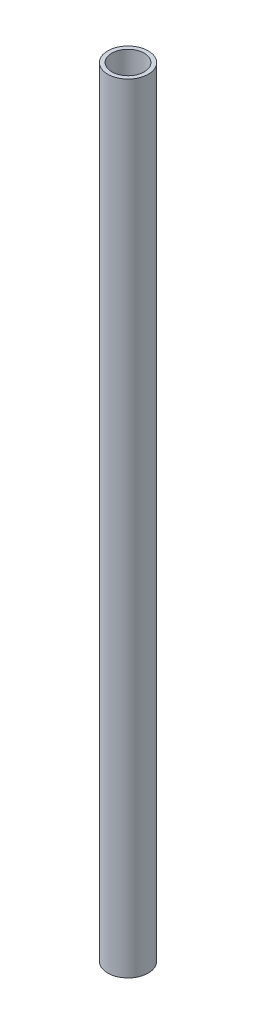
ISO-10303-21;
HEADER;
FILE_DESCRIPTION(('STEP AP214'),'2;1');
FILE_NAME('part.step','',(''),(''),'','','');
FILE_SCHEMA(('AUTOMOTIVE_DESIGN { 1 0 10303 214 1 1 1 1 }'));
ENDSEC;
DATA;
#1=APPLICATION_CONTEXT('core data for automotive mechanical design processes');
#2=APPLICATION_PROTOCOL_DEFINITION('international standard','automotive_design',2000,#1);
#3=PRODUCT_CONTEXT('',#1,'mechanical');
#4=PRODUCT('Part','Part','',(#3));
#5=PRODUCT_RELATED_PRODUCT_CATEGORY('part','',(#4));
#6=PRODUCT_DEFINITION_FORMATION('','',#4);
#7=PRODUCT_DEFINITION_CONTEXT('part definition',#1,'design');
#8=PRODUCT_DEFINITION('design','',#6,#7);
#9=PRODUCT_DEFINITION_SHAPE('','',#8);
#10=(LENGTH_UNIT() NAMED_UNIT(*) SI_UNIT(.MILLI.,.METRE.));
#11=(NAMED_UNIT(*) PLANE_ANGLE_UNIT() SI_UNIT($,.RADIAN.));
#12=(NAMED_UNIT(*) SI_UNIT($,.STERADIAN.) SOLID_ANGLE_UNIT());
#13=UNCERTAINTY_MEASURE_WITH_UNIT(LENGTH_MEASURE(1.E-05),#10,'distance_accuracy_value','');
#14=(GEOMETRIC_REPRESENTATION_CONTEXT(3) GLOBAL_UNCERTAINTY_ASSIGNED_CONTEXT((#13)) GLOBAL_UNIT_ASSIGNED_CONTEXT((#10,
#11,#12)) REPRESENTATION_CONTEXT('',''));
#15=CARTESIAN_POINT('',(0.,0.,0.));
#16=DIRECTION('',(0.,0.,1.));
#17=DIRECTION('',(1.,0.,0.));
#18=AXIS2_PLACEMENT_3D('',#15,#16,#17);
#19=CARTESIAN_POINT('',(0.,609.6,0.));
#20=DIRECTION('',(0.,1.,0.));
#21=DIRECTION('',(0.,0.,1.));
#22=AXIS2_PLACEMENT_3D('',#19,#20,#21);
#23=PLANE('',#22);
#24=CARTESIAN_POINT('',(0.,609.6,0.));
#25=DIRECTION('',(0.,1.,0.));
#26=DIRECTION('',(0.,0.,1.));
#27=AXIS2_PLACEMENT_3D('',#24,#25,#26);
#28=CIRCLE('',#27,15.875);
#29=CARTESIAN_POINT('',(0.,609.6,-15.875));
#30=VERTEX_POINT('',#29);
#31=EDGE_CURVE('E10',#30,#30,#28,.T.);
#32=ORIENTED_EDGE('',*,*,#31,.T.);
#33=EDGE_LOOP('',(#32));
#34=FACE_BOUND('',#33,.T.);
#35=CARTESIAN_POINT('',(0.,609.6,0.));
#36=DIRECTION('',(0.,1.,0.));
#37=DIRECTION('',(0.,0.,1.));
#38=AXIS2_PLACEMENT_3D('',#35,#36,#37);
#39=CIRCLE('',#38,12.7);
#40=CARTESIAN_POINT('',(0.,609.6,-12.7));
#41=VERTEX_POINT('',#40);
#42=EDGE_CURVE('E42',#41,#41,#39,.T.);
#43=ORIENTED_EDGE('',*,*,#42,.F.);
#44=EDGE_LOOP('',(#43));
#45=FACE_BOUND('',#44,.T.);
#46=ADVANCED_FACE('F31',(#34,#45),#23,.T.);
#47=CARTESIAN_POINT('',(0.,0.,0.));
#48=DIRECTION('',(0.,1.,0.));
#49=DIRECTION('',(0.,0.,1.));
#50=AXIS2_PLACEMENT_3D('',#47,#48,#49);
#51=PLANE('',#50);
#52=CARTESIAN_POINT('',(0.,0.,0.));
#53=DIRECTION('',(0.,1.,0.));
#54=DIRECTION('',(0.,0.,1.));
#55=AXIS2_PLACEMENT_3D('',#52,#53,#54);
#56=CIRCLE('',#55,15.875);
#57=CARTESIAN_POINT('',(0.,0.,-15.875));
#58=VERTEX_POINT('',#57);
#59=EDGE_CURVE('E35',#58,#58,#56,.T.);
#60=ORIENTED_EDGE('',*,*,#59,.F.);
#61=EDGE_LOOP('',(#60));
#62=FACE_BOUND('',#61,.T.);
#63=CARTESIAN_POINT('',(0.,0.,0.));
#64=DIRECTION('',(0.,1.,0.));
#65=DIRECTION('',(0.,0.,1.));
#66=AXIS2_PLACEMENT_3D('',#63,#64,#65);
#67=CIRCLE('',#66,12.7);
#68=CARTESIAN_POINT('',(0.,0.,-12.7));
#69=VERTEX_POINT('',#68);
#70=EDGE_CURVE('E44',#69,#69,#67,.T.);
#71=ORIENTED_EDGE('',*,*,#70,.T.);
#72=EDGE_LOOP('',(#71));
#73=FACE_BOUND('',#72,.T.);
#74=ADVANCED_FACE('F54',(#62,#73),#51,.F.);
#75=CARTESIAN_POINT('',(0.,609.6,0.));
#76=DIRECTION('',(0.,-1.,0.));
#77=DIRECTION('',(0.,0.,-1.));
#78=AXIS2_PLACEMENT_3D('',#75,#76,#77);
#79=CYLINDRICAL_SURFACE('',#78,15.875);
#80=CARTESIAN_POINT('',(0.,609.6,-15.875));
#81=CARTESIAN_POINT('',(0.,603.25,-15.875));
#82=CARTESIAN_POINT('',(0.,596.9,-15.875));
#83=CARTESIAN_POINT('',(0.,584.2,-15.875));
#84=CARTESIAN_POINT('',(0.,577.85,-15.875));
#85=CARTESIAN_POINT('',(0.,565.15,-15.875));
#86=CARTESIAN_POINT('',(0.,558.8,-15.875));
#87=CARTESIAN_POINT('',(0.,546.1,-15.875));
#88=CARTESIAN_POINT('',(0.,539.75,-15.875));
#89=CARTESIAN_POINT('',(0.,527.05,-15.875));
#90=CARTESIAN_POINT('',(0.,520.7,-15.875));
#91=CARTESIAN_POINT('',(0.,508.,-15.875));
#92=CARTESIAN_POINT('',(0.,501.65,-15.875));
#93=CARTESIAN_POINT('',(0.,488.95,-15.875));
#94=CARTESIAN_POINT('',(0.,482.6,-15.875));
#95=CARTESIAN_POINT('',(0.,469.9,-15.875));
#96=CARTESIAN_POINT('',(0.,463.55,-15.875));
#97=CARTESIAN_POINT('',(0.,450.85,-15.875));
#98=CARTESIAN_POINT('',(0.,444.5,-15.875));
#99=CARTESIAN_POINT('',(0.,431.8,-15.875));
#100=CARTESIAN_POINT('',(0.,425.45,-15.875));
#101=CARTESIAN_POINT('',(0.,412.75,-15.875));
#102=CARTESIAN_POINT('',(0.,406.4,-15.875));
#103=CARTESIAN_POINT('',(0.,393.7,-15.875));
#104=CARTESIAN_POINT('',(0.,387.35,-15.875));
#105=CARTESIAN_POINT('',(0.,374.65,-15.875));
#106=CARTESIAN_POINT('',(0.,368.3,-15.875));
#107=CARTESIAN_POINT('',(0.,355.6,-15.875));
#108=CARTESIAN_POINT('',(0.,349.25,-15.875));
#109=CARTESIAN_POINT('',(0.,336.55,-15.875));
#110=CARTESIAN_POINT('',(0.,330.2,-15.875));
#111=CARTESIAN_POINT('',(0.,317.5,-15.875));
#112=CARTESIAN_POINT('',(0.,311.15,-15.875));
#113=CARTESIAN_POINT('',(0.,298.45,-15.875));
#114=CARTESIAN_POINT('',(0.,292.1,-15.875));
#115=CARTESIAN_POINT('',(0.,279.4,-15.875));
#116=CARTESIAN_POINT('',(0.,273.05,-15.875));
#117=CARTESIAN_POINT('',(0.,260.35,-15.875));
#118=CARTESIAN_POINT('',(0.,254.,-15.875));
#119=CARTESIAN_POINT('',(0.,241.3,-15.875));
#120=CARTESIAN_POINT('',(0.,234.95,-15.875));
#121=CARTESIAN_POINT('',(0.,222.25,-15.875));
#122=CARTESIAN_POINT('',(0.,215.9,-15.875));
#123=CARTESIAN_POINT('',(0.,203.2,-15.875));
#124=CARTESIAN_POINT('',(0.,196.85,-15.875));
#125=CARTESIAN_POINT('',(0.,184.15,-15.875));
#126=CARTESIAN_POINT('',(0.,177.8,-15.875));
#127=CARTESIAN_POINT('',(0.,165.1,-15.875));
#128=CARTESIAN_POINT('',(0.,158.75,-15.875));
#129=CARTESIAN_POINT('',(0.,146.05,-15.875));
#130=CARTESIAN_POINT('',(0.,139.7,-15.875));
#131=CARTESIAN_POINT('',(0.,127.,-15.875));
#132=CARTESIAN_POINT('',(0.,120.65,-15.875));
#133=CARTESIAN_POINT('',(0.,107.95,-15.875));
#134=CARTESIAN_POINT('',(0.,101.6,-15.875));
#135=CARTESIAN_POINT('',(0.,88.9,-15.875));
#136=CARTESIAN_POINT('',(0.,82.5500000000001,-15.875));
#137=CARTESIAN_POINT('',(0.,69.85,-15.875));
#138=CARTESIAN_POINT('',(0.,63.5,-15.875));
#139=CARTESIAN_POINT('',(0.,50.8,-15.875));
#140=CARTESIAN_POINT('',(0.,44.45,-15.875));
#141=CARTESIAN_POINT('',(0.,31.75,-15.875));
#142=CARTESIAN_POINT('',(0.,25.4,-15.875));
#143=CARTESIAN_POINT('',(0.,12.7,-15.875));
#144=CARTESIAN_POINT('',(0.,6.35000000000001,-15.875));
#145=CARTESIAN_POINT('',(0.,0.,-15.875));
#146=B_SPLINE_CURVE_WITH_KNOTS('',3,(#80,#81,#82,#83,#84,#85,#86,#87,#88,#89,#90,#91,#92,#93,
#94,#95,#96,#97,#98,#99,#100,#101,#102,#103,#104,#105,#106,#107,#108,#109,#110,#111,#112,#113,
#114,#115,#116,#117,#118,#119,#120,#121,#122,#123,#124,#125,#126,#127,#128,#129,#130,#131,#132,
#133,#134,#135,#136,#137,#138,#139,#140,#141,#142,#143,#144,#145),.UNSPECIFIED.,.F.,.F.,(4,2,2,
2,2,2,2,2,2,2,2,2,2,2,2,2,2,2,2,2,2,2,2,2,2,2,2,2,2,2,2,2,4),(0.,19.05,38.1,57.15,76.2,
95.2500000000001,114.3,133.35,152.4,171.45,190.5,209.55,228.6,247.65,266.7,285.75,304.8,323.85,
342.9,361.95,381.,400.05,419.1,438.15,457.2,476.25,495.3,514.35,533.4,552.45,571.5,590.55,
609.6),.UNSPECIFIED.);
#147=EDGE_CURVE('BSEAM33',#30,#58,#146,.T.);
#148=ORIENTED_EDGE('',*,*,#31,.F.);
#149=ORIENTED_EDGE('',*,*,#59,.T.);
#150=ORIENTED_EDGE('',*,*,#147,.T.);
#151=ORIENTED_EDGE('',*,*,#147,.F.);
#152=EDGE_LOOP('',(#148,#150,#149,#151));
#153=FACE_BOUND('',#152,.T.);
#154=ADVANCED_FACE('F33',(#153),#79,.T.);
#155=CARTESIAN_POINT('',(0.,609.6,0.));
#156=DIRECTION('',(0.,-1.,0.));
#157=DIRECTION('',(0.,0.,-1.));
#158=AXIS2_PLACEMENT_3D('',#155,#156,#157);
#159=CYLINDRICAL_SURFACE('',#158,12.7);
#160=CARTESIAN_POINT('',(0.,609.6,-12.7));
#161=CARTESIAN_POINT('',(0.,603.25,-12.7));
#162=CARTESIAN_POINT('',(0.,596.9,-12.7));
#163=CARTESIAN_POINT('',(0.,584.2,-12.7));
#164=CARTESIAN_POINT('',(0.,577.85,-12.7));
#165=CARTESIAN_POINT('',(0.,565.15,-12.7));
#166=CARTESIAN_POINT('',(0.,558.8,-12.7));
#167=CARTESIAN_POINT('',(0.,546.1,-12.7));
#168=CARTESIAN_POINT('',(0.,539.75,-12.7));
#169=CARTESIAN_POINT('',(0.,527.05,-12.7));
#170=CARTESIAN_POINT('',(0.,520.7,-12.7));
#171=CARTESIAN_POINT('',(0.,508.,-12.7));
#172=CARTESIAN_POINT('',(0.,501.65,-12.7));
#173=CARTESIAN_POINT('',(0.,488.95,-12.7));
#174=CARTESIAN_POINT('',(0.,482.6,-12.7));
#175=CARTESIAN_POINT('',(0.,469.9,-12.7));
#176=CARTESIAN_POINT('',(0.,463.55,-12.7));
#177=CARTESIAN_POINT('',(0.,450.85,-12.7));
#178=CARTESIAN_POINT('',(0.,444.5,-12.7));
#179=CARTESIAN_POINT('',(0.,431.8,-12.7));
#180=CARTESIAN_POINT('',(0.,425.45,-12.7));
#181=CARTESIAN_POINT('',(0.,412.75,-12.7));
#182=CARTESIAN_POINT('',(0.,406.4,-12.7));
#183=CARTESIAN_POINT('',(0.,393.7,-12.7));
#184=CARTESIAN_POINT('',(0.,387.35,-12.7));
#185=CARTESIAN_POINT('',(0.,374.65,-12.7));
#186=CARTESIAN_POINT('',(0.,368.3,-12.7));
#187=CARTESIAN_POINT('',(0.,355.6,-12.7));
#188=CARTESIAN_POINT('',(0.,349.25,-12.7));
#189=CARTESIAN_POINT('',(0.,336.55,-12.7));
#190=CARTESIAN_POINT('',(0.,330.2,-12.7));
#191=CARTESIAN_POINT('',(0.,317.5,-12.7));
#192=CARTESIAN_POINT('',(0.,311.15,-12.7));
#193=CARTESIAN_POINT('',(0.,298.45,-12.7));
#194=CARTESIAN_POINT('',(0.,292.1,-12.7));
#195=CARTESIAN_POINT('',(0.,279.4,-12.7));
#196=CARTESIAN_POINT('',(0.,273.05,-12.7));
#197=CARTESIAN_POINT('',(0.,260.35,-12.7));
#198=CARTESIAN_POINT('',(0.,254.,-12.7));
#199=CARTESIAN_POINT('',(0.,241.3,-12.7));
#200=CARTESIAN_POINT('',(0.,234.95,-12.7));
#201=CARTESIAN_POINT('',(0.,222.25,-12.7));
#202=CARTESIAN_POINT('',(0.,215.9,-12.7));
#203=CARTESIAN_POINT('',(0.,203.2,-12.7));
#204=CARTESIAN_POINT('',(0.,196.85,-12.7));
#205=CARTESIAN_POINT('',(0.,184.15,-12.7));
#206=CARTESIAN_POINT('',(0.,177.8,-12.7));
#207=CARTESIAN_POINT('',(0.,165.1,-12.7));
#208=CARTESIAN_POINT('',(0.,158.75,-12.7));
#209=CARTESIAN_POINT('',(0.,146.05,-12.7));
#210=CARTESIAN_POINT('',(0.,139.7,-12.7));
#211=CARTESIAN_POINT('',(0.,127.,-12.7));
#212=CARTESIAN_POINT('',(0.,120.65,-12.7));
#213=CARTESIAN_POINT('',(0.,107.95,-12.7));
#214=CARTESIAN_POINT('',(0.,101.6,-12.7));
#215=CARTESIAN_POINT('',(0.,88.9,-12.7));
#216=CARTESIAN_POINT('',(0.,82.5500000000001,-12.7));
#217=CARTESIAN_POINT('',(0.,69.85,-12.7));
#218=CARTESIAN_POINT('',(0.,63.5,-12.7));
#219=CARTESIAN_POINT('',(0.,50.8,-12.7));
#220=CARTESIAN_POINT('',(0.,44.45,-12.7));
#221=CARTESIAN_POINT('',(0.,31.75,-12.7));
#222=CARTESIAN_POINT('',(0.,25.4,-12.7));
#223=CARTESIAN_POINT('',(0.,12.7,-12.7));
#224=CARTESIAN_POINT('',(0.,6.35000000000001,-12.7));
#225=CARTESIAN_POINT('',(0.,0.,-12.7));
#226=B_SPLINE_CURVE_WITH_KNOTS('',3,(#160,#161,#162,#163,#164,#165,#166,#167,#168,#169,#170,
#171,#172,#173,#174,#175,#176,#177,#178,#179,#180,#181,#182,#183,#184,#185,#186,#187,#188,#189,
#190,#191,#192,#193,#194,#195,#196,#197,#198,#199,#200,#201,#202,#203,#204,#205,#206,#207,#208,
#209,#210,#211,#212,#213,#214,#215,#216,#217,#218,#219,#220,#221,#222,#223,#224,#225),
.UNSPECIFIED.,.F.,.F.,(4,2,2,2,2,2,2,2,2,2,2,2,2,2,2,2,2,2,2,2,2,2,2,2,2,2,2,2,2,2,2,2,4),(0.,
19.05,38.1,57.15,76.2,95.2500000000001,114.3,133.35,152.4,171.45,190.5,209.55,228.6,247.65,
266.7,285.75,304.8,323.85,342.9,361.95,381.,400.05,419.1,438.15,457.2,476.25,495.3,514.35,533.4,
552.45,571.5,590.55,609.6),.UNSPECIFIED.);
#227=EDGE_CURVE('BSEAM50',#41,#69,#226,.T.);
#228=ORIENTED_EDGE('',*,*,#42,.T.);
#229=ORIENTED_EDGE('',*,*,#70,.F.);
#230=ORIENTED_EDGE('',*,*,#227,.T.);
#231=ORIENTED_EDGE('',*,*,#227,.F.);
#232=EDGE_LOOP('',(#228,#230,#229,#231));
#233=FACE_BOUND('',#232,.T.);
#234=ADVANCED_FACE('F50',(#233),#159,.F.);
#235=CLOSED_SHELL('',(#46,#74,#154,#234));
#236=MANIFOLD_SOLID_BREP('B2',#235);
#237=ADVANCED_BREP_SHAPE_REPRESENTATION('',(#18,#236),#14);
#238=SHAPE_DEFINITION_REPRESENTATION(#9,#237);
ENDSEC;
END-ISO-10303-21;
